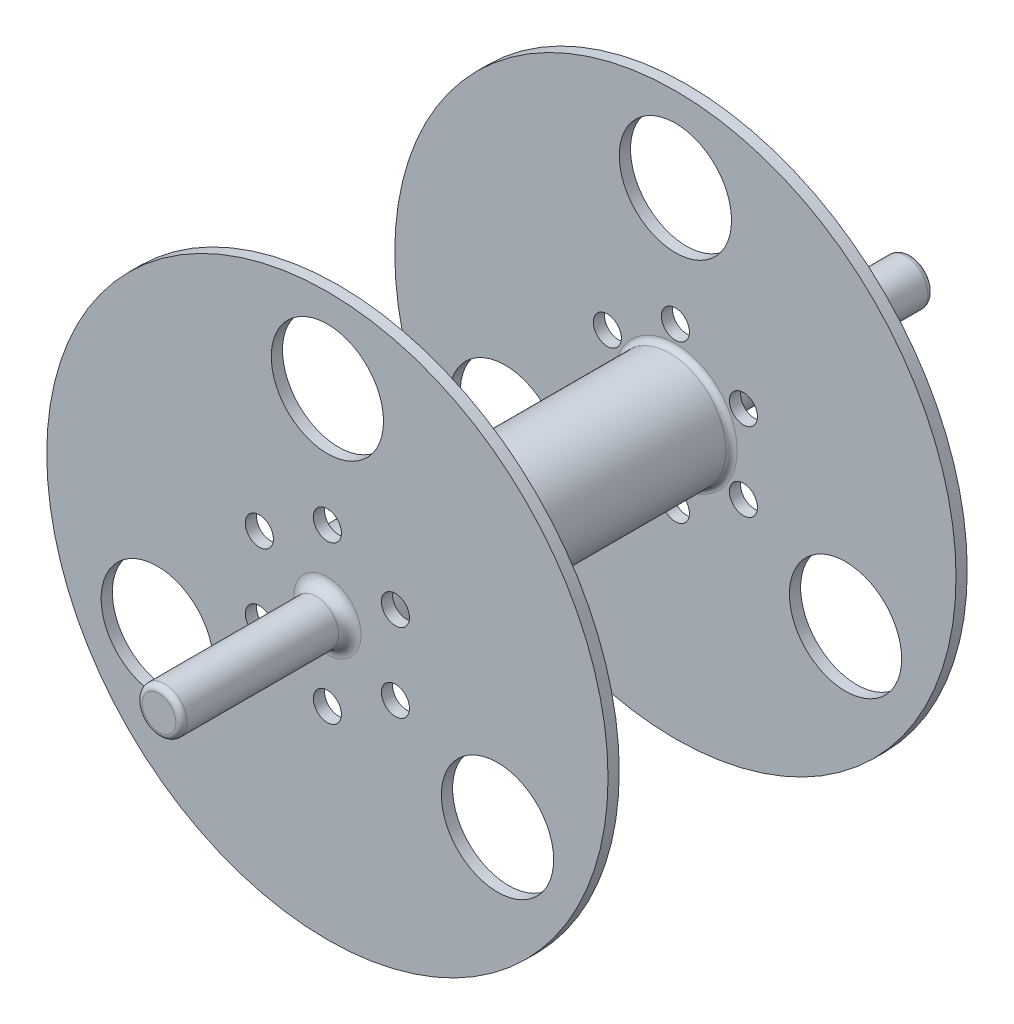
ISO-10303-21;
HEADER;
FILE_DESCRIPTION(('STEP AP214'),'2;1');
FILE_NAME('part.step','',(''),(''),'','','');
FILE_SCHEMA(('AUTOMOTIVE_DESIGN { 1 0 10303 214 1 1 1 1 }'));
ENDSEC;
DATA;
#1=APPLICATION_CONTEXT('core data for automotive mechanical design processes');
#2=APPLICATION_PROTOCOL_DEFINITION('international standard','automotive_design',2000,#1);
#3=PRODUCT_CONTEXT('',#1,'mechanical');
#4=PRODUCT('Part','Part','',(#3));
#5=PRODUCT_RELATED_PRODUCT_CATEGORY('part','',(#4));
#6=PRODUCT_DEFINITION_FORMATION('','',#4);
#7=PRODUCT_DEFINITION_CONTEXT('part definition',#1,'design');
#8=PRODUCT_DEFINITION('design','',#6,#7);
#9=PRODUCT_DEFINITION_SHAPE('','',#8);
#10=(LENGTH_UNIT() NAMED_UNIT(*) SI_UNIT(.MILLI.,.METRE.));
#11=(NAMED_UNIT(*) PLANE_ANGLE_UNIT() SI_UNIT($,.RADIAN.));
#12=(NAMED_UNIT(*) SI_UNIT($,.STERADIAN.) SOLID_ANGLE_UNIT());
#13=UNCERTAINTY_MEASURE_WITH_UNIT(LENGTH_MEASURE(1.E-05),#10,'distance_accuracy_value','');
#14=(GEOMETRIC_REPRESENTATION_CONTEXT(3) GLOBAL_UNCERTAINTY_ASSIGNED_CONTEXT((#13)) GLOBAL_UNIT_ASSIGNED_CONTEXT((#10,
#11,#12)) REPRESENTATION_CONTEXT('',''));
#15=CARTESIAN_POINT('',(0.,0.,0.));
#16=DIRECTION('',(0.,0.,1.));
#17=DIRECTION('',(1.,0.,0.));
#18=AXIS2_PLACEMENT_3D('',#15,#16,#17);
#19=CARTESIAN_POINT('',(0.,0.,64.));
#20=DIRECTION('',(0.,0.,1.));
#21=DIRECTION('',(1.,0.,0.));
#22=AXIS2_PLACEMENT_3D('',#19,#20,#21);
#23=PLANE('',#22);
#24=CARTESIAN_POINT('',(0.,0.,64.));
#25=DIRECTION('',(0.,0.,1.));
#26=DIRECTION('',(1.,0.,0.));
#27=AXIS2_PLACEMENT_3D('',#24,#25,#26);
#28=CIRCLE('',#27,6.);
#29=CARTESIAN_POINT('',(6.,0.,64.));
#30=VERTEX_POINT('',#29);
#31=EDGE_CURVE('E253',#30,#30,#28,.F.);
#32=ORIENTED_EDGE('',*,*,#31,.T.);
#33=EDGE_LOOP('',(#32));
#34=FACE_BOUND('',#33,.T.);
#35=CARTESIAN_POINT('',(30.3108891324553,-17.5,64.));
#36=DIRECTION('',(0.,0.,-1.));
#37=DIRECTION('',(-1.,0.,0.));
#38=AXIS2_PLACEMENT_3D('',#35,#36,#37);
#39=CIRCLE('',#38,10.);
#40=CARTESIAN_POINT('',(40.3108891324553,-17.5,64.));
#41=VERTEX_POINT('',#40);
#42=EDGE_CURVE('E232',#41,#41,#39,.T.);
#43=ORIENTED_EDGE('',*,*,#42,.T.);
#44=EDGE_LOOP('',(#43));
#45=FACE_BOUND('',#44,.T.);
#46=CARTESIAN_POINT('',(-30.3108891324554,-17.5,64.));
#47=DIRECTION('',(0.,0.,-1.));
#48=DIRECTION('',(-1.,0.,0.));
#49=AXIS2_PLACEMENT_3D('',#46,#47,#48);
#50=CIRCLE('',#49,10.);
#51=CARTESIAN_POINT('',(-20.3108891324554,-17.5,64.));
#52=VERTEX_POINT('',#51);
#53=EDGE_CURVE('E221',#52,#52,#50,.T.);
#54=ORIENTED_EDGE('',*,*,#53,.T.);
#55=EDGE_LOOP('',(#54));
#56=FACE_BOUND('',#55,.T.);
#57=CARTESIAN_POINT('',(-12.1243556529821,-7.,64.));
#58=DIRECTION('',(0.,0.,-1.));
#59=DIRECTION('',(-1.,0.,0.));
#60=AXIS2_PLACEMENT_3D('',#57,#58,#59);
#61=CIRCLE('',#60,2.5);
#62=CARTESIAN_POINT('',(-9.62435565298214,-7.,64.));
#63=VERTEX_POINT('',#62);
#64=EDGE_CURVE('E245',#63,#63,#61,.T.);
#65=ORIENTED_EDGE('',*,*,#64,.T.);
#66=EDGE_LOOP('',(#65));
#67=FACE_BOUND('',#66,.T.);
#68=CARTESIAN_POINT('',(12.1243556529821,7.,64.));
#69=DIRECTION('',(0.,0.,-1.));
#70=DIRECTION('',(-1.,0.,0.));
#71=AXIS2_PLACEMENT_3D('',#68,#69,#70);
#72=CIRCLE('',#71,2.5);
#73=CARTESIAN_POINT('',(14.6243556529821,7.,64.));
#74=VERTEX_POINT('',#73);
#75=EDGE_CURVE('E360',#74,#74,#72,.T.);
#76=ORIENTED_EDGE('',*,*,#75,.T.);
#77=EDGE_LOOP('',(#76));
#78=FACE_BOUND('',#77,.T.);
#79=CARTESIAN_POINT('',(0.,-14.,64.));
#80=DIRECTION('',(0.,0.,-1.));
#81=DIRECTION('',(-1.,0.,0.));
#82=AXIS2_PLACEMENT_3D('',#79,#80,#81);
#83=CIRCLE('',#82,2.5);
#84=CARTESIAN_POINT('',(2.5,-14.,64.));
#85=VERTEX_POINT('',#84);
#86=EDGE_CURVE('E294',#85,#85,#83,.T.);
#87=ORIENTED_EDGE('',*,*,#86,.T.);
#88=EDGE_LOOP('',(#87));
#89=FACE_BOUND('',#88,.T.);
#90=CARTESIAN_POINT('',(0.,14.,64.));
#91=DIRECTION('',(0.,0.,-1.));
#92=DIRECTION('',(-1.,0.,0.));
#93=AXIS2_PLACEMENT_3D('',#90,#91,#92);
#94=CIRCLE('',#93,2.5);
#95=CARTESIAN_POINT('',(2.5,14.,64.));
#96=VERTEX_POINT('',#95);
#97=EDGE_CURVE('E322',#96,#96,#94,.T.);
#98=ORIENTED_EDGE('',*,*,#97,.T.);
#99=EDGE_LOOP('',(#98));
#100=FACE_BOUND('',#99,.T.);
#101=CARTESIAN_POINT('',(0.,35.,64.));
#102=DIRECTION('',(0.,0.,-1.));
#103=DIRECTION('',(-1.,0.,0.));
#104=AXIS2_PLACEMENT_3D('',#101,#102,#103);
#105=CIRCLE('',#104,10.);
#106=CARTESIAN_POINT('',(10.,35.,64.));
#107=VERTEX_POINT('',#106);
#108=EDGE_CURVE('E227',#107,#107,#105,.T.);
#109=ORIENTED_EDGE('',*,*,#108,.T.);
#110=EDGE_LOOP('',(#109));
#111=FACE_BOUND('',#110,.T.);
#112=CARTESIAN_POINT('',(-12.1243556529821,7.,64.));
#113=DIRECTION('',(0.,0.,-1.));
#114=DIRECTION('',(-1.,0.,0.));
#115=AXIS2_PLACEMENT_3D('',#112,#113,#114);
#116=CIRCLE('',#115,2.5);
#117=CARTESIAN_POINT('',(-9.62435565298214,7.,64.));
#118=VERTEX_POINT('',#117);
#119=EDGE_CURVE('E313',#118,#118,#116,.T.);
#120=ORIENTED_EDGE('',*,*,#119,.T.);
#121=EDGE_LOOP('',(#120));
#122=FACE_BOUND('',#121,.T.);
#123=CARTESIAN_POINT('',(12.1243556529821,-7.,64.));
#124=DIRECTION('',(0.,0.,-1.));
#125=DIRECTION('',(-1.,0.,0.));
#126=AXIS2_PLACEMENT_3D('',#123,#124,#125);
#127=CIRCLE('',#126,2.5);
#128=CARTESIAN_POINT('',(14.6243556529821,-7.,64.));
#129=VERTEX_POINT('',#128);
#130=EDGE_CURVE('E276',#129,#129,#127,.T.);
#131=ORIENTED_EDGE('',*,*,#130,.T.);
#132=EDGE_LOOP('',(#131));
#133=FACE_BOUND('',#132,.T.);
#134=CARTESIAN_POINT('',(0.,0.,64.));
#135=DIRECTION('',(0.,0.,1.));
#136=DIRECTION('',(1.,0.,0.));
#137=AXIS2_PLACEMENT_3D('',#134,#135,#136);
#138=CIRCLE('',#137,50.);
#139=CARTESIAN_POINT('',(-50.,0.,64.));
#140=VERTEX_POINT('',#139);
#141=EDGE_CURVE('E199',#140,#140,#138,.T.);
#142=ORIENTED_EDGE('',*,*,#141,.T.);
#143=EDGE_LOOP('',(#142));
#144=FACE_BOUND('',#143,.T.);
#145=ADVANCED_FACE('F48',(#34,#45,#56,#67,#78,#89,#100,#111,#122,#133,#144),#23,.T.);
#146=CARTESIAN_POINT('',(0.,0.,63.));
#147=DIRECTION('',(0.,0.,1.));
#148=DIRECTION('',(1.,0.,0.));
#149=AXIS2_PLACEMENT_3D('',#146,#147,#148);
#150=CYLINDRICAL_SURFACE('',#149,50.);
#151=ORIENTED_EDGE('',*,*,#141,.F.);
#152=DIRECTION('',(0.,0.,-1.));
#153=VECTOR('',#152,1.);
#154=CARTESIAN_POINT('',(-50.,0.,63.));
#155=LINE('',#154,#153);
#156=CARTESIAN_POINT('',(-50.,0.,62.));
#157=VERTEX_POINT('',#156);
#158=EDGE_CURVE('E194',#140,#157,#155,.T.);
#159=ORIENTED_EDGE('',*,*,#158,.T.);
#160=CARTESIAN_POINT('',(0.,0.,62.));
#161=DIRECTION('',(0.,0.,1.));
#162=DIRECTION('',(1.,0.,0.));
#163=AXIS2_PLACEMENT_3D('',#160,#161,#162);
#164=CIRCLE('',#163,50.);
#165=EDGE_CURVE('E197',#157,#157,#164,.T.);
#166=ORIENTED_EDGE('',*,*,#165,.T.);
#167=ORIENTED_EDGE('',*,*,#158,.F.);
#168=EDGE_LOOP('',(#151,#159,#166,#167));
#169=FACE_BOUND('',#168,.T.);
#170=ADVANCED_FACE('F195',(#169),#150,.T.);
#171=CARTESIAN_POINT('',(50.,0.,62.));
#172=DIRECTION('',(0.,0.,-1.));
#173=DIRECTION('',(0.,-1.,0.));
#174=AXIS2_PLACEMENT_3D('',#171,#172,#173);
#175=PLANE('',#174);
#176=CARTESIAN_POINT('',(0.,0.,62.));
#177=DIRECTION('',(0.,0.,-1.));
#178=DIRECTION('',(-1.,0.,0.));
#179=AXIS2_PLACEMENT_3D('',#176,#177,#178);
#180=CIRCLE('',#179,11.);
#181=CARTESIAN_POINT('',(-11.,0.,62.));
#182=VERTEX_POINT('',#181);
#183=EDGE_CURVE('E268',#182,#182,#180,.F.);
#184=ORIENTED_EDGE('',*,*,#183,.T.);
#185=EDGE_LOOP('',(#184));
#186=FACE_BOUND('',#185,.T.);
#187=CARTESIAN_POINT('',(30.3108891324553,-17.5,62.));
#188=DIRECTION('',(0.,0.,1.));
#189=DIRECTION('',(-1.,0.,0.));
#190=AXIS2_PLACEMENT_3D('',#187,#188,#189);
#191=CIRCLE('',#190,10.);
#192=CARTESIAN_POINT('',(40.3108891324553,-17.5,62.));
#193=VERTEX_POINT('',#192);
#194=EDGE_CURVE('E343',#193,#193,#191,.T.);
#195=ORIENTED_EDGE('',*,*,#194,.T.);
#196=EDGE_LOOP('',(#195));
#197=FACE_BOUND('',#196,.T.);
#198=CARTESIAN_POINT('',(-30.3108891324554,-17.5,62.));
#199=DIRECTION('',(0.,0.,1.));
#200=DIRECTION('',(-1.,0.,0.));
#201=AXIS2_PLACEMENT_3D('',#198,#199,#200);
#202=CIRCLE('',#201,10.);
#203=CARTESIAN_POINT('',(-20.3108891324554,-17.5,62.));
#204=VERTEX_POINT('',#203);
#205=EDGE_CURVE('E337',#204,#204,#202,.T.);
#206=ORIENTED_EDGE('',*,*,#205,.T.);
#207=EDGE_LOOP('',(#206));
#208=FACE_BOUND('',#207,.T.);
#209=CARTESIAN_POINT('',(-12.1243556529821,-7.,62.));
#210=DIRECTION('',(0.,0.,1.));
#211=DIRECTION('',(-1.,0.,0.));
#212=AXIS2_PLACEMENT_3D('',#209,#210,#211);
#213=CIRCLE('',#212,2.5);
#214=CARTESIAN_POINT('',(-9.62435565298214,-7.,62.));
#215=VERTEX_POINT('',#214);
#216=EDGE_CURVE('E290',#215,#215,#213,.T.);
#217=ORIENTED_EDGE('',*,*,#216,.T.);
#218=EDGE_LOOP('',(#217));
#219=FACE_BOUND('',#218,.T.);
#220=CARTESIAN_POINT('',(12.1243556529821,7.,62.));
#221=DIRECTION('',(0.,0.,1.));
#222=DIRECTION('',(-1.,0.,0.));
#223=AXIS2_PLACEMENT_3D('',#220,#221,#222);
#224=CIRCLE('',#223,2.5);
#225=CARTESIAN_POINT('',(14.6243556529821,7.,62.));
#226=VERTEX_POINT('',#225);
#227=EDGE_CURVE('E355',#226,#226,#224,.T.);
#228=ORIENTED_EDGE('',*,*,#227,.T.);
#229=EDGE_LOOP('',(#228));
#230=FACE_BOUND('',#229,.T.);
#231=CARTESIAN_POINT('',(0.,-14.,62.));
#232=DIRECTION('',(0.,0.,1.));
#233=DIRECTION('',(-1.,0.,0.));
#234=AXIS2_PLACEMENT_3D('',#231,#232,#233);
#235=CIRCLE('',#234,2.5);
#236=CARTESIAN_POINT('',(2.5,-14.,62.));
#237=VERTEX_POINT('',#236);
#238=EDGE_CURVE('E314',#237,#237,#235,.T.);
#239=ORIENTED_EDGE('',*,*,#238,.T.);
#240=EDGE_LOOP('',(#239));
#241=FACE_BOUND('',#240,.T.);
#242=CARTESIAN_POINT('',(0.,14.,62.));
#243=DIRECTION('',(0.,0.,1.));
#244=DIRECTION('',(-1.,0.,0.));
#245=AXIS2_PLACEMENT_3D('',#242,#243,#244);
#246=CIRCLE('',#245,2.5);
#247=CARTESIAN_POINT('',(2.5,14.,62.));
#248=VERTEX_POINT('',#247);
#249=EDGE_CURVE('E210',#248,#248,#246,.T.);
#250=ORIENTED_EDGE('',*,*,#249,.T.);
#251=EDGE_LOOP('',(#250));
#252=FACE_BOUND('',#251,.T.);
#253=CARTESIAN_POINT('',(0.,35.,62.));
#254=DIRECTION('',(0.,0.,1.));
#255=DIRECTION('',(-1.,0.,0.));
#256=AXIS2_PLACEMENT_3D('',#253,#254,#255);
#257=CIRCLE('',#256,10.);
#258=CARTESIAN_POINT('',(10.,35.,62.));
#259=VERTEX_POINT('',#258);
#260=EDGE_CURVE('E226',#259,#259,#257,.T.);
#261=ORIENTED_EDGE('',*,*,#260,.T.);
#262=EDGE_LOOP('',(#261));
#263=FACE_BOUND('',#262,.T.);
#264=CARTESIAN_POINT('',(-12.1243556529821,7.,62.));
#265=DIRECTION('',(0.,0.,1.));
#266=DIRECTION('',(-1.,0.,0.));
#267=AXIS2_PLACEMENT_3D('',#264,#265,#266);
#268=CIRCLE('',#267,2.5);
#269=CARTESIAN_POINT('',(-9.62435565298214,7.,62.));
#270=VERTEX_POINT('',#269);
#271=EDGE_CURVE('E308',#270,#270,#268,.T.);
#272=ORIENTED_EDGE('',*,*,#271,.T.);
#273=EDGE_LOOP('',(#272));
#274=FACE_BOUND('',#273,.T.);
#275=CARTESIAN_POINT('',(12.1243556529821,-7.,62.));
#276=DIRECTION('',(0.,0.,1.));
#277=DIRECTION('',(-1.,0.,0.));
#278=AXIS2_PLACEMENT_3D('',#275,#276,#277);
#279=CIRCLE('',#278,2.5);
#280=CARTESIAN_POINT('',(14.6243556529821,-7.,62.));
#281=VERTEX_POINT('',#280);
#282=EDGE_CURVE('E286',#281,#281,#279,.T.);
#283=ORIENTED_EDGE('',*,*,#282,.T.);
#284=EDGE_LOOP('',(#283));
#285=FACE_BOUND('',#284,.T.);
#286=ORIENTED_EDGE('',*,*,#165,.F.);
#287=EDGE_LOOP('',(#286));
#288=FACE_BOUND('',#287,.T.);
#289=ADVANCED_FACE('F426',(#186,#197,#208,#219,#230,#241,#252,#263,#274,#285,#288),#175,.T.);
#290=CARTESIAN_POINT('',(0.,0.,32.));
#291=DIRECTION('',(0.,0.,1.));
#292=DIRECTION('',(1.,0.,0.));
#293=AXIS2_PLACEMENT_3D('',#290,#291,#292);
#294=CYLINDRICAL_SURFACE('',#293,10.);
#295=DIRECTION('',(0.,0.,-1.));
#296=VECTOR('',#295,1.);
#297=CARTESIAN_POINT('',(-10.,0.,32.));
#298=LINE('',#297,#296);
#299=CARTESIAN_POINT('',(-10.,0.,61.));
#300=VERTEX_POINT('',#299);
#301=CARTESIAN_POINT('',(-10.,0.,3.));
#302=VERTEX_POINT('',#301);
#303=EDGE_CURVE('E243',#300,#302,#298,.T.);
#304=ORIENTED_EDGE('',*,*,#303,.F.);
#305=CARTESIAN_POINT('',(0.,0.,61.));
#306=DIRECTION('',(0.,0.,-1.));
#307=DIRECTION('',(-1.,0.,0.));
#308=AXIS2_PLACEMENT_3D('',#305,#306,#307);
#309=CIRCLE('',#308,10.);
#310=EDGE_CURVE('E57',#300,#300,#309,.T.);
#311=ORIENTED_EDGE('',*,*,#310,.T.);
#312=ORIENTED_EDGE('',*,*,#303,.T.);
#313=CARTESIAN_POINT('',(0.,0.,3.));
#314=DIRECTION('',(0.,0.,1.));
#315=DIRECTION('',(1.,0.,0.));
#316=AXIS2_PLACEMENT_3D('',#313,#314,#315);
#317=CIRCLE('',#316,10.);
#318=EDGE_CURVE('E271',#302,#302,#317,.T.);
#319=ORIENTED_EDGE('',*,*,#318,.T.);
#320=EDGE_LOOP('',(#304,#311,#312,#319));
#321=FACE_BOUND('',#320,.T.);
#322=ADVANCED_FACE('F429',(#321),#294,.T.);
#323=CARTESIAN_POINT('',(10.,0.,2.));
#324=DIRECTION('',(0.,0.,1.));
#325=DIRECTION('',(1.,0.,0.));
#326=AXIS2_PLACEMENT_3D('',#323,#324,#325);
#327=PLANE('',#326);
#328=CARTESIAN_POINT('',(0.,0.,2.));
#329=DIRECTION('',(0.,0.,1.));
#330=DIRECTION('',(1.,0.,0.));
#331=AXIS2_PLACEMENT_3D('',#328,#329,#330);
#332=CIRCLE('',#331,11.);
#333=CARTESIAN_POINT('',(-11.,0.,2.));
#334=VERTEX_POINT('',#333);
#335=EDGE_CURVE('E11',#334,#334,#332,.F.);
#336=ORIENTED_EDGE('',*,*,#335,.T.);
#337=EDGE_LOOP('',(#336));
#338=FACE_BOUND('',#337,.T.);
#339=CARTESIAN_POINT('',(30.3108891324553,-17.5,2.));
#340=DIRECTION('',(0.,0.,-1.));
#341=DIRECTION('',(-1.,0.,0.));
#342=AXIS2_PLACEMENT_3D('',#339,#340,#341);
#343=CIRCLE('',#342,10.);
#344=CARTESIAN_POINT('',(40.3108891324553,-17.5,2.));
#345=VERTEX_POINT('',#344);
#346=EDGE_CURVE('E299',#345,#345,#343,.T.);
#347=ORIENTED_EDGE('',*,*,#346,.T.);
#348=EDGE_LOOP('',(#347));
#349=FACE_BOUND('',#348,.T.);
#350=CARTESIAN_POINT('',(-30.3108891324554,-17.5,2.));
#351=DIRECTION('',(0.,0.,-1.));
#352=DIRECTION('',(-1.,0.,0.));
#353=AXIS2_PLACEMENT_3D('',#350,#351,#352);
#354=CIRCLE('',#353,10.);
#355=CARTESIAN_POINT('',(-20.3108891324554,-17.5,2.));
#356=VERTEX_POINT('',#355);
#357=EDGE_CURVE('E240',#356,#356,#354,.T.);
#358=ORIENTED_EDGE('',*,*,#357,.T.);
#359=EDGE_LOOP('',(#358));
#360=FACE_BOUND('',#359,.T.);
#361=CARTESIAN_POINT('',(-12.1243556529821,-7.,2.));
#362=DIRECTION('',(0.,0.,-1.));
#363=DIRECTION('',(-1.,0.,0.));
#364=AXIS2_PLACEMENT_3D('',#361,#362,#363);
#365=CIRCLE('',#364,2.5);
#366=CARTESIAN_POINT('',(-9.62435565298214,-7.,2.));
#367=VERTEX_POINT('',#366);
#368=EDGE_CURVE('E349',#367,#367,#365,.T.);
#369=ORIENTED_EDGE('',*,*,#368,.T.);
#370=EDGE_LOOP('',(#369));
#371=FACE_BOUND('',#370,.T.);
#372=CARTESIAN_POINT('',(12.1243556529821,7.,2.));
#373=DIRECTION('',(0.,0.,-1.));
#374=DIRECTION('',(-1.,0.,0.));
#375=AXIS2_PLACEMENT_3D('',#372,#373,#374);
#376=CIRCLE('',#375,2.5);
#377=CARTESIAN_POINT('',(14.6243556529821,7.,2.));
#378=VERTEX_POINT('',#377);
#379=EDGE_CURVE('E352',#378,#378,#376,.T.);
#380=ORIENTED_EDGE('',*,*,#379,.T.);
#381=EDGE_LOOP('',(#380));
#382=FACE_BOUND('',#381,.T.);
#383=CARTESIAN_POINT('',(0.,-14.,2.));
#384=DIRECTION('',(0.,0.,-1.));
#385=DIRECTION('',(-1.,0.,0.));
#386=AXIS2_PLACEMENT_3D('',#383,#384,#385);
#387=CIRCLE('',#386,2.5);
#388=CARTESIAN_POINT('',(2.5,-14.,2.));
#389=VERTEX_POINT('',#388);
#390=EDGE_CURVE('E316',#389,#389,#387,.T.);
#391=ORIENTED_EDGE('',*,*,#390,.T.);
#392=EDGE_LOOP('',(#391));
#393=FACE_BOUND('',#392,.T.);
#394=CARTESIAN_POINT('',(0.,14.,2.));
#395=DIRECTION('',(0.,0.,-1.));
#396=DIRECTION('',(-1.,0.,0.));
#397=AXIS2_PLACEMENT_3D('',#394,#395,#396);
#398=CIRCLE('',#397,2.5);
#399=CARTESIAN_POINT('',(2.5,14.,2.));
#400=VERTEX_POINT('',#399);
#401=EDGE_CURVE('E212',#400,#400,#398,.T.);
#402=ORIENTED_EDGE('',*,*,#401,.T.);
#403=EDGE_LOOP('',(#402));
#404=FACE_BOUND('',#403,.T.);
#405=CARTESIAN_POINT('',(0.,35.,2.));
#406=DIRECTION('',(0.,0.,-1.));
#407=DIRECTION('',(-1.,0.,0.));
#408=AXIS2_PLACEMENT_3D('',#405,#406,#407);
#409=CIRCLE('',#408,10.);
#410=CARTESIAN_POINT('',(10.,35.,2.));
#411=VERTEX_POINT('',#410);
#412=EDGE_CURVE('E340',#411,#411,#409,.T.);
#413=ORIENTED_EDGE('',*,*,#412,.T.);
#414=EDGE_LOOP('',(#413));
#415=FACE_BOUND('',#414,.T.);
#416=CARTESIAN_POINT('',(-12.1243556529821,7.,2.));
#417=DIRECTION('',(0.,0.,-1.));
#418=DIRECTION('',(-1.,0.,0.));
#419=AXIS2_PLACEMENT_3D('',#416,#417,#418);
#420=CIRCLE('',#419,2.5);
#421=CARTESIAN_POINT('',(-9.62435565298214,7.,2.));
#422=VERTEX_POINT('',#421);
#423=EDGE_CURVE('E208',#422,#422,#420,.T.);
#424=ORIENTED_EDGE('',*,*,#423,.T.);
#425=EDGE_LOOP('',(#424));
#426=FACE_BOUND('',#425,.T.);
#427=CARTESIAN_POINT('',(12.1243556529821,-7.,2.));
#428=DIRECTION('',(0.,0.,-1.));
#429=DIRECTION('',(-1.,0.,0.));
#430=AXIS2_PLACEMENT_3D('',#427,#428,#429);
#431=CIRCLE('',#430,2.5);
#432=CARTESIAN_POINT('',(14.6243556529821,-7.,2.));
#433=VERTEX_POINT('',#432);
#434=EDGE_CURVE('E304',#433,#433,#431,.T.);
#435=ORIENTED_EDGE('',*,*,#434,.T.);
#436=EDGE_LOOP('',(#435));
#437=FACE_BOUND('',#436,.T.);
#438=CARTESIAN_POINT('',(0.,0.,2.));
#439=DIRECTION('',(0.,0.,1.));
#440=DIRECTION('',(1.,0.,0.));
#441=AXIS2_PLACEMENT_3D('',#438,#439,#440);
#442=CIRCLE('',#441,50.);
#443=CARTESIAN_POINT('',(-50.,0.,2.));
#444=VERTEX_POINT('',#443);
#445=EDGE_CURVE('E217',#444,#444,#442,.T.);
#446=ORIENTED_EDGE('',*,*,#445,.T.);
#447=EDGE_LOOP('',(#446));
#448=FACE_BOUND('',#447,.T.);
#449=ADVANCED_FACE('F536',(#338,#349,#360,#371,#382,#393,#404,#415,#426,#437,#448),#327,.T.);
#450=CARTESIAN_POINT('',(0.,0.,1.));
#451=DIRECTION('',(0.,0.,1.));
#452=DIRECTION('',(1.,0.,0.));
#453=AXIS2_PLACEMENT_3D('',#450,#451,#452);
#454=CYLINDRICAL_SURFACE('',#453,50.);
#455=ORIENTED_EDGE('',*,*,#445,.F.);
#456=DIRECTION('',(0.,0.,-1.));
#457=VECTOR('',#456,1.);
#458=CARTESIAN_POINT('',(-50.,0.,1.));
#459=LINE('',#458,#457);
#460=CARTESIAN_POINT('',(-50.,0.,0.));
#461=VERTEX_POINT('',#460);
#462=EDGE_CURVE('E241',#444,#461,#459,.T.);
#463=ORIENTED_EDGE('',*,*,#462,.T.);
#464=CARTESIAN_POINT('',(0.,0.,0.));
#465=DIRECTION('',(0.,0.,1.));
#466=DIRECTION('',(1.,0.,0.));
#467=AXIS2_PLACEMENT_3D('',#464,#465,#466);
#468=CIRCLE('',#467,50.);
#469=EDGE_CURVE('E214',#461,#461,#468,.T.);
#470=ORIENTED_EDGE('',*,*,#469,.T.);
#471=ORIENTED_EDGE('',*,*,#462,.F.);
#472=EDGE_LOOP('',(#455,#463,#470,#471));
#473=FACE_BOUND('',#472,.T.);
#474=ADVANCED_FACE('F521',(#473),#454,.T.);
#475=CARTESIAN_POINT('',(30.3108891324553,-17.5,64.));
#476=DIRECTION('',(0.,0.,-1.));
#477=DIRECTION('',(-1.,0.,0.));
#478=AXIS2_PLACEMENT_3D('',#475,#476,#477);
#479=CYLINDRICAL_SURFACE('',#478,10.);
#480=ORIENTED_EDGE('',*,*,#346,.F.);
#481=DIRECTION('',(0.,0.,-1.));
#482=VECTOR('',#481,1.);
#483=CARTESIAN_POINT('',(40.3108891324553,-17.5,64.));
#484=LINE('',#483,#482);
#485=CARTESIAN_POINT('',(40.3108891324553,-17.5,0.));
#486=VERTEX_POINT('',#485);
#487=EDGE_CURVE('E296',#345,#486,#484,.T.);
#488=ORIENTED_EDGE('',*,*,#487,.T.);
#489=CARTESIAN_POINT('',(30.3108891324553,-17.5,0.));
#490=DIRECTION('',(0.,0.,1.));
#491=DIRECTION('',(-1.,0.,0.));
#492=AXIS2_PLACEMENT_3D('',#489,#490,#491);
#493=CIRCLE('',#492,10.);
#494=EDGE_CURVE('E218',#486,#486,#493,.T.);
#495=ORIENTED_EDGE('',*,*,#494,.F.);
#496=ORIENTED_EDGE('',*,*,#487,.F.);
#497=EDGE_LOOP('',(#480,#488,#495,#496));
#498=FACE_BOUND('',#497,.T.);
#499=ADVANCED_FACE('F518',(#498),#479,.F.);
#500=CARTESIAN_POINT('',(30.3108891324553,-17.5,64.));
#501=DIRECTION('',(0.,0.,-1.));
#502=DIRECTION('',(-1.,0.,0.));
#503=AXIS2_PLACEMENT_3D('',#500,#501,#502);
#504=CYLINDRICAL_SURFACE('',#503,10.);
#505=ORIENTED_EDGE('',*,*,#42,.F.);
#506=DIRECTION('',(0.,0.,-1.));
#507=VECTOR('',#506,1.);
#508=CARTESIAN_POINT('',(40.3108891324553,-17.5,64.));
#509=LINE('',#508,#507);
#510=EDGE_CURVE('E235',#41,#193,#509,.T.);
#511=ORIENTED_EDGE('',*,*,#510,.T.);
#512=ORIENTED_EDGE('',*,*,#194,.F.);
#513=ORIENTED_EDGE('',*,*,#510,.F.);
#514=EDGE_LOOP('',(#505,#511,#512,#513));
#515=FACE_BOUND('',#514,.T.);
#516=ADVANCED_FACE('F406',(#515),#504,.F.);
#517=CARTESIAN_POINT('',(-30.3108891324554,-17.5,64.));
#518=DIRECTION('',(0.,0.,-1.));
#519=DIRECTION('',(-1.,0.,0.));
#520=AXIS2_PLACEMENT_3D('',#517,#518,#519);
#521=CYLINDRICAL_SURFACE('',#520,10.);
#522=ORIENTED_EDGE('',*,*,#357,.F.);
#523=DIRECTION('',(0.,0.,-1.));
#524=VECTOR('',#523,1.);
#525=CARTESIAN_POINT('',(-20.3108891324554,-17.5,64.));
#526=LINE('',#525,#524);
#527=CARTESIAN_POINT('',(-20.3108891324554,-17.5,0.));
#528=VERTEX_POINT('',#527);
#529=EDGE_CURVE('E237',#356,#528,#526,.T.);
#530=ORIENTED_EDGE('',*,*,#529,.T.);
#531=CARTESIAN_POINT('',(-30.3108891324554,-17.5,0.));
#532=DIRECTION('',(0.,0.,1.));
#533=DIRECTION('',(-1.,0.,0.));
#534=AXIS2_PLACEMENT_3D('',#531,#532,#533);
#535=CIRCLE('',#534,10.);
#536=EDGE_CURVE('E236',#528,#528,#535,.T.);
#537=ORIENTED_EDGE('',*,*,#536,.F.);
#538=ORIENTED_EDGE('',*,*,#529,.F.);
#539=EDGE_LOOP('',(#522,#530,#537,#538));
#540=FACE_BOUND('',#539,.T.);
#541=ADVANCED_FACE('F516',(#540),#521,.F.);
#542=CARTESIAN_POINT('',(-30.3108891324554,-17.5,64.));
#543=DIRECTION('',(0.,0.,-1.));
#544=DIRECTION('',(-1.,0.,0.));
#545=AXIS2_PLACEMENT_3D('',#542,#543,#544);
#546=CYLINDRICAL_SURFACE('',#545,10.);
#547=ORIENTED_EDGE('',*,*,#53,.F.);
#548=DIRECTION('',(0.,0.,-1.));
#549=VECTOR('',#548,1.);
#550=CARTESIAN_POINT('',(-20.3108891324554,-17.5,64.));
#551=LINE('',#550,#549);
#552=EDGE_CURVE('E336',#52,#204,#551,.T.);
#553=ORIENTED_EDGE('',*,*,#552,.T.);
#554=ORIENTED_EDGE('',*,*,#205,.F.);
#555=ORIENTED_EDGE('',*,*,#552,.F.);
#556=EDGE_LOOP('',(#547,#553,#554,#555));
#557=FACE_BOUND('',#556,.T.);
#558=ADVANCED_FACE('F512',(#557),#546,.F.);
#559=CARTESIAN_POINT('',(-12.1243556529821,-7.,64.));
#560=DIRECTION('',(0.,0.,-1.));
#561=DIRECTION('',(-1.,0.,0.));
#562=AXIS2_PLACEMENT_3D('',#559,#560,#561);
#563=CYLINDRICAL_SURFACE('',#562,2.5);
#564=ORIENTED_EDGE('',*,*,#368,.F.);
#565=DIRECTION('',(0.,0.,-1.));
#566=VECTOR('',#565,1.);
#567=CARTESIAN_POINT('',(-9.62435565298214,-7.,64.));
#568=LINE('',#567,#566);
#569=CARTESIAN_POINT('',(-9.62435565298214,-7.,0.));
#570=VERTEX_POINT('',#569);
#571=EDGE_CURVE('E222',#367,#570,#568,.T.);
#572=ORIENTED_EDGE('',*,*,#571,.T.);
#573=CARTESIAN_POINT('',(-12.1243556529821,-7.,0.));
#574=DIRECTION('',(0.,0.,1.));
#575=DIRECTION('',(-1.,0.,0.));
#576=AXIS2_PLACEMENT_3D('',#573,#574,#575);
#577=CIRCLE('',#576,2.5);
#578=EDGE_CURVE('E219',#570,#570,#577,.T.);
#579=ORIENTED_EDGE('',*,*,#578,.F.);
#580=ORIENTED_EDGE('',*,*,#571,.F.);
#581=EDGE_LOOP('',(#564,#572,#579,#580));
#582=FACE_BOUND('',#581,.T.);
#583=ADVANCED_FACE('F515',(#582),#563,.F.);
#584=CARTESIAN_POINT('',(-12.1243556529821,-7.,64.));
#585=DIRECTION('',(0.,0.,-1.));
#586=DIRECTION('',(-1.,0.,0.));
#587=AXIS2_PLACEMENT_3D('',#584,#585,#586);
#588=CYLINDRICAL_SURFACE('',#587,2.5);
#589=ORIENTED_EDGE('',*,*,#64,.F.);
#590=DIRECTION('',(0.,0.,-1.));
#591=VECTOR('',#590,1.);
#592=CARTESIAN_POINT('',(-9.62435565298214,-7.,64.));
#593=LINE('',#592,#591);
#594=EDGE_CURVE('E303',#63,#215,#593,.T.);
#595=ORIENTED_EDGE('',*,*,#594,.T.);
#596=ORIENTED_EDGE('',*,*,#216,.F.);
#597=ORIENTED_EDGE('',*,*,#594,.F.);
#598=EDGE_LOOP('',(#589,#595,#596,#597));
#599=FACE_BOUND('',#598,.T.);
#600=ADVANCED_FACE('F530',(#599),#588,.F.);
#601=CARTESIAN_POINT('',(12.1243556529821,7.,64.));
#602=DIRECTION('',(0.,0.,-1.));
#603=DIRECTION('',(-1.,0.,0.));
#604=AXIS2_PLACEMENT_3D('',#601,#602,#603);
#605=CYLINDRICAL_SURFACE('',#604,2.5);
#606=ORIENTED_EDGE('',*,*,#379,.F.);
#607=DIRECTION('',(0.,0.,-1.));
#608=VECTOR('',#607,1.);
#609=CARTESIAN_POINT('',(14.6243556529821,7.,64.));
#610=LINE('',#609,#608);
#611=CARTESIAN_POINT('',(14.6243556529821,7.,0.));
#612=VERTEX_POINT('',#611);
#613=EDGE_CURVE('E246',#378,#612,#610,.T.);
#614=ORIENTED_EDGE('',*,*,#613,.T.);
#615=CARTESIAN_POINT('',(12.1243556529821,7.,0.));
#616=DIRECTION('',(0.,0.,1.));
#617=DIRECTION('',(-1.,0.,0.));
#618=AXIS2_PLACEMENT_3D('',#615,#616,#617);
#619=CIRCLE('',#618,2.5);
#620=EDGE_CURVE('E244',#612,#612,#619,.T.);
#621=ORIENTED_EDGE('',*,*,#620,.F.);
#622=ORIENTED_EDGE('',*,*,#613,.F.);
#623=EDGE_LOOP('',(#606,#614,#621,#622));
#624=FACE_BOUND('',#623,.T.);
#625=ADVANCED_FACE('F506',(#624),#605,.F.);
#626=CARTESIAN_POINT('',(12.1243556529821,7.,64.));
#627=DIRECTION('',(0.,0.,-1.));
#628=DIRECTION('',(-1.,0.,0.));
#629=AXIS2_PLACEMENT_3D('',#626,#627,#628);
#630=CYLINDRICAL_SURFACE('',#629,2.5);
#631=ORIENTED_EDGE('',*,*,#75,.F.);
#632=DIRECTION('',(0.,0.,-1.));
#633=VECTOR('',#632,1.);
#634=CARTESIAN_POINT('',(14.6243556529821,7.,64.));
#635=LINE('',#634,#633);
#636=EDGE_CURVE('E357',#74,#226,#635,.T.);
#637=ORIENTED_EDGE('',*,*,#636,.T.);
#638=ORIENTED_EDGE('',*,*,#227,.F.);
#639=ORIENTED_EDGE('',*,*,#636,.F.);
#640=EDGE_LOOP('',(#631,#637,#638,#639));
#641=FACE_BOUND('',#640,.T.);
#642=ADVANCED_FACE('F503',(#641),#630,.F.);
#643=CARTESIAN_POINT('',(0.,-14.,64.));
#644=DIRECTION('',(0.,0.,-1.));
#645=DIRECTION('',(-1.,0.,0.));
#646=AXIS2_PLACEMENT_3D('',#643,#644,#645);
#647=CYLINDRICAL_SURFACE('',#646,2.5);
#648=ORIENTED_EDGE('',*,*,#390,.F.);
#649=DIRECTION('',(0.,0.,-1.));
#650=VECTOR('',#649,1.);
#651=CARTESIAN_POINT('',(2.5,-14.,64.));
#652=LINE('',#651,#650);
#653=CARTESIAN_POINT('',(2.5,-14.,0.));
#654=VERTEX_POINT('',#653);
#655=EDGE_CURVE('E325',#389,#654,#652,.T.);
#656=ORIENTED_EDGE('',*,*,#655,.T.);
#657=CARTESIAN_POINT('',(0.,-14.,0.));
#658=DIRECTION('',(0.,0.,1.));
#659=DIRECTION('',(-1.,0.,0.));
#660=AXIS2_PLACEMENT_3D('',#657,#658,#659);
#661=CIRCLE('',#660,2.5);
#662=EDGE_CURVE('E328',#654,#654,#661,.T.);
#663=ORIENTED_EDGE('',*,*,#662,.F.);
#664=ORIENTED_EDGE('',*,*,#655,.F.);
#665=EDGE_LOOP('',(#648,#656,#663,#664));
#666=FACE_BOUND('',#665,.T.);
#667=ADVANCED_FACE('F450',(#666),#647,.F.);
#668=CARTESIAN_POINT('',(0.,-14.,64.));
#669=DIRECTION('',(0.,0.,-1.));
#670=DIRECTION('',(-1.,0.,0.));
#671=AXIS2_PLACEMENT_3D('',#668,#669,#670);
#672=CYLINDRICAL_SURFACE('',#671,2.5);
#673=ORIENTED_EDGE('',*,*,#86,.F.);
#674=DIRECTION('',(0.,0.,-1.));
#675=VECTOR('',#674,1.);
#676=CARTESIAN_POINT('',(2.5,-14.,64.));
#677=LINE('',#676,#675);
#678=EDGE_CURVE('E317',#85,#237,#677,.T.);
#679=ORIENTED_EDGE('',*,*,#678,.T.);
#680=ORIENTED_EDGE('',*,*,#238,.F.);
#681=ORIENTED_EDGE('',*,*,#678,.F.);
#682=EDGE_LOOP('',(#673,#679,#680,#681));
#683=FACE_BOUND('',#682,.T.);
#684=ADVANCED_FACE('F524',(#683),#672,.F.);
#685=CARTESIAN_POINT('',(0.,14.,64.));
#686=DIRECTION('',(0.,0.,-1.));
#687=DIRECTION('',(-1.,0.,0.));
#688=AXIS2_PLACEMENT_3D('',#685,#686,#687);
#689=CYLINDRICAL_SURFACE('',#688,2.5);
#690=ORIENTED_EDGE('',*,*,#401,.F.);
#691=DIRECTION('',(0.,0.,-1.));
#692=VECTOR('',#691,1.);
#693=CARTESIAN_POINT('',(2.5,14.,64.));
#694=LINE('',#693,#692);
#695=CARTESIAN_POINT('',(2.5,14.,0.));
#696=VERTEX_POINT('',#695);
#697=EDGE_CURVE('E295',#400,#696,#694,.T.);
#698=ORIENTED_EDGE('',*,*,#697,.T.);
#699=CARTESIAN_POINT('',(0.,14.,0.));
#700=DIRECTION('',(0.,0.,1.));
#701=DIRECTION('',(-1.,0.,0.));
#702=AXIS2_PLACEMENT_3D('',#699,#700,#701);
#703=CIRCLE('',#702,2.5);
#704=EDGE_CURVE('E292',#696,#696,#703,.T.);
#705=ORIENTED_EDGE('',*,*,#704,.F.);
#706=ORIENTED_EDGE('',*,*,#697,.F.);
#707=EDGE_LOOP('',(#690,#698,#705,#706));
#708=FACE_BOUND('',#707,.T.);
#709=ADVANCED_FACE('F510',(#708),#689,.F.);
#710=CARTESIAN_POINT('',(0.,14.,64.));
#711=DIRECTION('',(0.,0.,-1.));
#712=DIRECTION('',(-1.,0.,0.));
#713=AXIS2_PLACEMENT_3D('',#710,#711,#712);
#714=CYLINDRICAL_SURFACE('',#713,2.5);
#715=ORIENTED_EDGE('',*,*,#97,.F.);
#716=DIRECTION('',(0.,0.,-1.));
#717=VECTOR('',#716,1.);
#718=CARTESIAN_POINT('',(2.5,14.,64.));
#719=LINE('',#718,#717);
#720=EDGE_CURVE('E213',#96,#248,#719,.T.);
#721=ORIENTED_EDGE('',*,*,#720,.T.);
#722=ORIENTED_EDGE('',*,*,#249,.F.);
#723=ORIENTED_EDGE('',*,*,#720,.F.);
#724=EDGE_LOOP('',(#715,#721,#722,#723));
#725=FACE_BOUND('',#724,.T.);
#726=ADVANCED_FACE('F498',(#725),#714,.F.);
#727=CARTESIAN_POINT('',(0.,35.,64.));
#728=DIRECTION('',(0.,0.,-1.));
#729=DIRECTION('',(-1.,0.,0.));
#730=AXIS2_PLACEMENT_3D('',#727,#728,#729);
#731=CYLINDRICAL_SURFACE('',#730,10.);
#732=ORIENTED_EDGE('',*,*,#412,.F.);
#733=DIRECTION('',(0.,0.,-1.));
#734=VECTOR('',#733,1.);
#735=CARTESIAN_POINT('',(10.,35.,64.));
#736=LINE('',#735,#734);
#737=CARTESIAN_POINT('',(10.,35.,0.));
#738=VERTEX_POINT('',#737);
#739=EDGE_CURVE('E367',#411,#738,#736,.T.);
#740=ORIENTED_EDGE('',*,*,#739,.T.);
#741=CARTESIAN_POINT('',(0.,35.,0.));
#742=DIRECTION('',(0.,0.,1.));
#743=DIRECTION('',(-1.,0.,0.));
#744=AXIS2_PLACEMENT_3D('',#741,#742,#743);
#745=CIRCLE('',#744,10.);
#746=EDGE_CURVE('E333',#738,#738,#745,.T.);
#747=ORIENTED_EDGE('',*,*,#746,.F.);
#748=ORIENTED_EDGE('',*,*,#739,.F.);
#749=EDGE_LOOP('',(#732,#740,#747,#748));
#750=FACE_BOUND('',#749,.T.);
#751=ADVANCED_FACE('F490',(#750),#731,.F.);
#752=CARTESIAN_POINT('',(0.,35.,64.));
#753=DIRECTION('',(0.,0.,-1.));
#754=DIRECTION('',(-1.,0.,0.));
#755=AXIS2_PLACEMENT_3D('',#752,#753,#754);
#756=CYLINDRICAL_SURFACE('',#755,10.);
#757=ORIENTED_EDGE('',*,*,#108,.F.);
#758=DIRECTION('',(0.,0.,-1.));
#759=VECTOR('',#758,1.);
#760=CARTESIAN_POINT('',(10.,35.,64.));
#761=LINE('',#760,#759);
#762=EDGE_CURVE('E223',#107,#259,#761,.T.);
#763=ORIENTED_EDGE('',*,*,#762,.T.);
#764=ORIENTED_EDGE('',*,*,#260,.F.);
#765=ORIENTED_EDGE('',*,*,#762,.F.);
#766=EDGE_LOOP('',(#757,#763,#764,#765));
#767=FACE_BOUND('',#766,.T.);
#768=ADVANCED_FACE('F487',(#767),#756,.F.);
#769=CARTESIAN_POINT('',(-12.1243556529821,7.,64.));
#770=DIRECTION('',(0.,0.,-1.));
#771=DIRECTION('',(-1.,0.,0.));
#772=AXIS2_PLACEMENT_3D('',#769,#770,#771);
#773=CYLINDRICAL_SURFACE('',#772,2.5);
#774=ORIENTED_EDGE('',*,*,#423,.F.);
#775=DIRECTION('',(0.,0.,-1.));
#776=VECTOR('',#775,1.);
#777=CARTESIAN_POINT('',(-9.62435565298214,7.,64.));
#778=LINE('',#777,#776);
#779=CARTESIAN_POINT('',(-9.62435565298214,7.,0.));
#780=VERTEX_POINT('',#779);
#781=EDGE_CURVE('E228',#422,#780,#778,.T.);
#782=ORIENTED_EDGE('',*,*,#781,.T.);
#783=CARTESIAN_POINT('',(-12.1243556529821,7.,0.));
#784=DIRECTION('',(0.,0.,1.));
#785=DIRECTION('',(-1.,0.,0.));
#786=AXIS2_PLACEMENT_3D('',#783,#784,#785);
#787=CIRCLE('',#786,2.5);
#788=EDGE_CURVE('E231',#780,#780,#787,.T.);
#789=ORIENTED_EDGE('',*,*,#788,.F.);
#790=ORIENTED_EDGE('',*,*,#781,.F.);
#791=EDGE_LOOP('',(#774,#782,#789,#790));
#792=FACE_BOUND('',#791,.T.);
#793=ADVANCED_FACE('F489',(#792),#773,.F.);
#794=CARTESIAN_POINT('',(-12.1243556529821,7.,64.));
#795=DIRECTION('',(0.,0.,-1.));
#796=DIRECTION('',(-1.,0.,0.));
#797=AXIS2_PLACEMENT_3D('',#794,#795,#796);
#798=CYLINDRICAL_SURFACE('',#797,2.5);
#799=ORIENTED_EDGE('',*,*,#119,.F.);
#800=DIRECTION('',(0.,0.,-1.));
#801=VECTOR('',#800,1.);
#802=CARTESIAN_POINT('',(-9.62435565298214,7.,64.));
#803=LINE('',#802,#801);
#804=EDGE_CURVE('E310',#118,#270,#803,.T.);
#805=ORIENTED_EDGE('',*,*,#804,.T.);
#806=ORIENTED_EDGE('',*,*,#271,.F.);
#807=ORIENTED_EDGE('',*,*,#804,.F.);
#808=EDGE_LOOP('',(#799,#805,#806,#807));
#809=FACE_BOUND('',#808,.T.);
#810=ADVANCED_FACE('F423',(#809),#798,.F.);
#811=CARTESIAN_POINT('',(12.1243556529821,-7.,64.));
#812=DIRECTION('',(0.,0.,-1.));
#813=DIRECTION('',(-1.,0.,0.));
#814=AXIS2_PLACEMENT_3D('',#811,#812,#813);
#815=CYLINDRICAL_SURFACE('',#814,2.5);
#816=ORIENTED_EDGE('',*,*,#434,.F.);
#817=DIRECTION('',(0.,0.,-1.));
#818=VECTOR('',#817,1.);
#819=CARTESIAN_POINT('',(14.6243556529821,-7.,64.));
#820=LINE('',#819,#818);
#821=CARTESIAN_POINT('',(14.6243556529821,-7.,0.));
#822=VERTEX_POINT('',#821);
#823=EDGE_CURVE('E307',#433,#822,#820,.T.);
#824=ORIENTED_EDGE('',*,*,#823,.T.);
#825=CARTESIAN_POINT('',(12.1243556529821,-7.,0.));
#826=DIRECTION('',(0.,0.,1.));
#827=DIRECTION('',(-1.,0.,0.));
#828=AXIS2_PLACEMENT_3D('',#825,#826,#827);
#829=CIRCLE('',#828,2.5);
#830=EDGE_CURVE('E311',#822,#822,#829,.T.);
#831=ORIENTED_EDGE('',*,*,#830,.F.);
#832=ORIENTED_EDGE('',*,*,#823,.F.);
#833=EDGE_LOOP('',(#816,#824,#831,#832));
#834=FACE_BOUND('',#833,.T.);
#835=ADVANCED_FACE('F438',(#834),#815,.F.);
#836=CARTESIAN_POINT('',(12.1243556529821,-7.,64.));
#837=DIRECTION('',(0.,0.,-1.));
#838=DIRECTION('',(-1.,0.,0.));
#839=AXIS2_PLACEMENT_3D('',#836,#837,#838);
#840=CYLINDRICAL_SURFACE('',#839,2.5);
#841=ORIENTED_EDGE('',*,*,#130,.F.);
#842=DIRECTION('',(0.,0.,-1.));
#843=VECTOR('',#842,1.);
#844=CARTESIAN_POINT('',(14.6243556529821,-7.,64.));
#845=LINE('',#844,#843);
#846=EDGE_CURVE('E281',#129,#281,#845,.T.);
#847=ORIENTED_EDGE('',*,*,#846,.T.);
#848=ORIENTED_EDGE('',*,*,#282,.F.);
#849=ORIENTED_EDGE('',*,*,#846,.F.);
#850=EDGE_LOOP('',(#841,#847,#848,#849));
#851=FACE_BOUND('',#850,.T.);
#852=ADVANCED_FACE('F435',(#851),#840,.F.);
#853=CARTESIAN_POINT('',(0.,0.,0.));
#854=DIRECTION('',(0.,0.,-1.));
#855=DIRECTION('',(-1.,0.,0.));
#856=AXIS2_PLACEMENT_3D('',#853,#854,#855);
#857=PLANE('',#856);
#858=CARTESIAN_POINT('',(0.,0.,0.));
#859=DIRECTION('',(0.,0.,-1.));
#860=DIRECTION('',(-1.,0.,0.));
#861=AXIS2_PLACEMENT_3D('',#858,#859,#860);
#862=CIRCLE('',#861,6.);
#863=CARTESIAN_POINT('',(-6.,0.,0.));
#864=VERTEX_POINT('',#863);
#865=EDGE_CURVE('E203',#864,#864,#862,.F.);
#866=ORIENTED_EDGE('',*,*,#865,.T.);
#867=EDGE_LOOP('',(#866));
#868=FACE_BOUND('',#867,.T.);
#869=ORIENTED_EDGE('',*,*,#494,.T.);
#870=EDGE_LOOP('',(#869));
#871=FACE_BOUND('',#870,.T.);
#872=ORIENTED_EDGE('',*,*,#536,.T.);
#873=EDGE_LOOP('',(#872));
#874=FACE_BOUND('',#873,.T.);
#875=ORIENTED_EDGE('',*,*,#578,.T.);
#876=EDGE_LOOP('',(#875));
#877=FACE_BOUND('',#876,.T.);
#878=ORIENTED_EDGE('',*,*,#620,.T.);
#879=EDGE_LOOP('',(#878));
#880=FACE_BOUND('',#879,.T.);
#881=ORIENTED_EDGE('',*,*,#662,.T.);
#882=EDGE_LOOP('',(#881));
#883=FACE_BOUND('',#882,.T.);
#884=ORIENTED_EDGE('',*,*,#704,.T.);
#885=EDGE_LOOP('',(#884));
#886=FACE_BOUND('',#885,.T.);
#887=ORIENTED_EDGE('',*,*,#746,.T.);
#888=EDGE_LOOP('',(#887));
#889=FACE_BOUND('',#888,.T.);
#890=ORIENTED_EDGE('',*,*,#788,.T.);
#891=EDGE_LOOP('',(#890));
#892=FACE_BOUND('',#891,.T.);
#893=ORIENTED_EDGE('',*,*,#830,.T.);
#894=EDGE_LOOP('',(#893));
#895=FACE_BOUND('',#894,.T.);
#896=ORIENTED_EDGE('',*,*,#469,.F.);
#897=EDGE_LOOP('',(#896));
#898=FACE_BOUND('',#897,.T.);
#899=ADVANCED_FACE('F437',(#868,#871,#874,#877,#880,#883,#886,#889,#892,#895,#898),#857,.T.);
#900=CARTESIAN_POINT('',(0.,0.,-40.));
#901=DIRECTION('',(0.,0.,1.));
#902=DIRECTION('',(1.,0.,0.));
#903=AXIS2_PLACEMENT_3D('',#900,#901,#902);
#904=CYLINDRICAL_SURFACE('',#903,4.);
#905=CARTESIAN_POINT('',(0.,0.,-39.));
#906=DIRECTION('',(0.,0.,-1.));
#907=DIRECTION('',(-1.,0.,0.));
#908=AXIS2_PLACEMENT_3D('',#905,#906,#907);
#909=CIRCLE('',#908,4.);
#910=CARTESIAN_POINT('',(-4.,0.,-39.));
#911=VERTEX_POINT('',#910);
#912=EDGE_CURVE('E265',#911,#911,#909,.F.);
#913=ORIENTED_EDGE('',*,*,#912,.T.);
#914=EDGE_LOOP('',(#913));
#915=FACE_BOUND('',#914,.T.);
#916=CARTESIAN_POINT('',(0.,0.,-2.));
#917=DIRECTION('',(0.,0.,-1.));
#918=DIRECTION('',(-1.,0.,0.));
#919=AXIS2_PLACEMENT_3D('',#916,#917,#918);
#920=CIRCLE('',#919,4.);
#921=CARTESIAN_POINT('',(-4.,0.,-2.));
#922=VERTEX_POINT('',#921);
#923=EDGE_CURVE('E200',#922,#922,#920,.T.);
#924=ORIENTED_EDGE('',*,*,#923,.T.);
#925=EDGE_LOOP('',(#924));
#926=FACE_BOUND('',#925,.T.);
#927=ADVANCED_FACE('F444',(#915,#926),#904,.T.);
#928=CARTESIAN_POINT('',(0.,0.,-40.));
#929=DIRECTION('',(0.,0.,-1.));
#930=DIRECTION('',(-1.,0.,0.));
#931=AXIS2_PLACEMENT_3D('',#928,#929,#930);
#932=PLANE('',#931);
#933=CARTESIAN_POINT('',(0.,0.,-40.));
#934=DIRECTION('',(0.,0.,-1.));
#935=DIRECTION('',(-1.,0.,0.));
#936=AXIS2_PLACEMENT_3D('',#933,#934,#935);
#937=CIRCLE('',#936,3.);
#938=CARTESIAN_POINT('',(-3.,0.,-40.));
#939=VERTEX_POINT('',#938);
#940=EDGE_CURVE('E262',#939,#939,#937,.T.);
#941=ORIENTED_EDGE('',*,*,#940,.T.);
#942=EDGE_LOOP('',(#941));
#943=FACE_BOUND('',#942,.T.);
#944=ADVANCED_FACE('F673',(#943),#932,.T.);
#945=CARTESIAN_POINT('',(0.,0.,94.));
#946=DIRECTION('',(0.,0.,-1.));
#947=DIRECTION('',(-1.,0.,0.));
#948=AXIS2_PLACEMENT_3D('',#945,#946,#947);
#949=CYLINDRICAL_SURFACE('',#948,4.);
#950=CARTESIAN_POINT('',(0.,0.,93.));
#951=DIRECTION('',(0.,0.,1.));
#952=DIRECTION('',(1.,0.,0.));
#953=AXIS2_PLACEMENT_3D('',#950,#951,#952);
#954=CIRCLE('',#953,4.);
#955=CARTESIAN_POINT('',(4.,0.,93.));
#956=VERTEX_POINT('',#955);
#957=EDGE_CURVE('E259',#956,#956,#954,.F.);
#958=ORIENTED_EDGE('',*,*,#957,.T.);
#959=EDGE_LOOP('',(#958));
#960=FACE_BOUND('',#959,.T.);
#961=CARTESIAN_POINT('',(0.,0.,66.));
#962=DIRECTION('',(0.,0.,1.));
#963=DIRECTION('',(1.,0.,0.));
#964=AXIS2_PLACEMENT_3D('',#961,#962,#963);
#965=CIRCLE('',#964,4.);
#966=CARTESIAN_POINT('',(4.,0.,66.));
#967=VERTEX_POINT('',#966);
#968=EDGE_CURVE('E250',#967,#967,#965,.T.);
#969=ORIENTED_EDGE('',*,*,#968,.T.);
#970=EDGE_LOOP('',(#969));
#971=FACE_BOUND('',#970,.T.);
#972=ADVANCED_FACE('F684',(#960,#971),#949,.T.);
#973=CARTESIAN_POINT('',(0.,0.,94.));
#974=DIRECTION('',(0.,0.,1.));
#975=DIRECTION('',(1.,0.,0.));
#976=AXIS2_PLACEMENT_3D('',#973,#974,#975);
#977=PLANE('',#976);
#978=CARTESIAN_POINT('',(0.,0.,94.));
#979=DIRECTION('',(0.,0.,1.));
#980=DIRECTION('',(1.,0.,0.));
#981=AXIS2_PLACEMENT_3D('',#978,#979,#980);
#982=CIRCLE('',#981,3.);
#983=CARTESIAN_POINT('',(3.,0.,94.));
#984=VERTEX_POINT('',#983);
#985=EDGE_CURVE('E256',#984,#984,#982,.T.);
#986=ORIENTED_EDGE('',*,*,#985,.T.);
#987=EDGE_LOOP('',(#986));
#988=FACE_BOUND('',#987,.T.);
#989=ADVANCED_FACE('F457',(#988),#977,.T.);
#990=CARTESIAN_POINT('',(0.,0.,-2.));
#991=DIRECTION('',(0.,0.,-1.));
#992=DIRECTION('',(-1.,0.,0.));
#993=AXIS2_PLACEMENT_3D('',#990,#991,#992);
#994=TOROIDAL_SURFACE('',#993,6.,2.);
#995=ORIENTED_EDGE('',*,*,#865,.F.);
#996=EDGE_LOOP('',(#995));
#997=FACE_BOUND('',#996,.T.);
#998=ORIENTED_EDGE('',*,*,#923,.F.);
#999=EDGE_LOOP('',(#998));
#1000=FACE_BOUND('',#999,.T.);
#1001=ADVANCED_FACE('F453',(#997,#1000),#994,.F.);
#1002=CARTESIAN_POINT('',(0.,0.,66.));
#1003=DIRECTION('',(0.,0.,1.));
#1004=DIRECTION('',(1.,0.,0.));
#1005=AXIS2_PLACEMENT_3D('',#1002,#1003,#1004);
#1006=TOROIDAL_SURFACE('',#1005,6.,2.);
#1007=ORIENTED_EDGE('',*,*,#31,.F.);
#1008=EDGE_LOOP('',(#1007));
#1009=FACE_BOUND('',#1008,.T.);
#1010=ORIENTED_EDGE('',*,*,#968,.F.);
#1011=EDGE_LOOP('',(#1010));
#1012=FACE_BOUND('',#1011,.T.);
#1013=ADVANCED_FACE('F456',(#1009,#1012),#1006,.F.);
#1014=CARTESIAN_POINT('',(0.,0.,93.));
#1015=DIRECTION('',(0.,0.,1.));
#1016=DIRECTION('',(1.,0.,0.));
#1017=AXIS2_PLACEMENT_3D('',#1014,#1015,#1016);
#1018=TOROIDAL_SURFACE('',#1017,3.,1.);
#1019=ORIENTED_EDGE('',*,*,#957,.F.);
#1020=EDGE_LOOP('',(#1019));
#1021=FACE_BOUND('',#1020,.T.);
#1022=ORIENTED_EDGE('',*,*,#985,.F.);
#1023=EDGE_LOOP('',(#1022));
#1024=FACE_BOUND('',#1023,.T.);
#1025=ADVANCED_FACE('F461',(#1021,#1024),#1018,.T.);
#1026=CARTESIAN_POINT('',(0.,0.,-39.));
#1027=DIRECTION('',(0.,0.,-1.));
#1028=DIRECTION('',(-1.,0.,0.));
#1029=AXIS2_PLACEMENT_3D('',#1026,#1027,#1028);
#1030=TOROIDAL_SURFACE('',#1029,3.,1.);
#1031=ORIENTED_EDGE('',*,*,#912,.F.);
#1032=EDGE_LOOP('',(#1031));
#1033=FACE_BOUND('',#1032,.T.);
#1034=ORIENTED_EDGE('',*,*,#940,.F.);
#1035=EDGE_LOOP('',(#1034));
#1036=FACE_BOUND('',#1035,.T.);
#1037=ADVANCED_FACE('F465',(#1033,#1036),#1030,.T.);
#1038=CARTESIAN_POINT('',(0.,0.,61.));
#1039=DIRECTION('',(0.,0.,-1.));
#1040=DIRECTION('',(-1.,0.,0.));
#1041=AXIS2_PLACEMENT_3D('',#1038,#1039,#1040);
#1042=TOROIDAL_SURFACE('',#1041,11.,1.);
#1043=CARTESIAN_POINT('',(-11.,0.,61.));
#1044=DIRECTION('',(0.,-1.,0.));
#1045=DIRECTION('',(1.,0.,0.));
#1046=AXIS2_PLACEMENT_3D('',#1043,#1044,#1045);
#1047=CIRCLE('',#1046,1.);
#1048=EDGE_CURVE('E275',#300,#182,#1047,.T.);
#1049=ORIENTED_EDGE('',*,*,#1048,.F.);
#1050=ORIENTED_EDGE('',*,*,#310,.F.);
#1051=ORIENTED_EDGE('',*,*,#1048,.T.);
#1052=ORIENTED_EDGE('',*,*,#183,.F.);
#1053=EDGE_LOOP('',(#1049,#1050,#1051,#1052));
#1054=FACE_BOUND('',#1053,.T.);
#1055=ADVANCED_FACE('F468',(#1054),#1042,.F.);
#1056=CARTESIAN_POINT('',(0.,0.,3.));
#1057=DIRECTION('',(0.,0.,1.));
#1058=DIRECTION('',(1.,0.,0.));
#1059=AXIS2_PLACEMENT_3D('',#1056,#1057,#1058);
#1060=TOROIDAL_SURFACE('',#1059,11.,1.);
#1061=CARTESIAN_POINT('',(-11.,0.,3.));
#1062=DIRECTION('',(0.,-1.,0.));
#1063=DIRECTION('',(1.,0.,0.));
#1064=AXIS2_PLACEMENT_3D('',#1061,#1062,#1063);
#1065=CIRCLE('',#1064,1.);
#1066=EDGE_CURVE('E52',#334,#302,#1065,.T.);
#1067=ORIENTED_EDGE('',*,*,#1066,.F.);
#1068=ORIENTED_EDGE('',*,*,#335,.F.);
#1069=ORIENTED_EDGE('',*,*,#1066,.T.);
#1070=ORIENTED_EDGE('',*,*,#318,.F.);
#1071=EDGE_LOOP('',(#1067,#1068,#1069,#1070));
#1072=FACE_BOUND('',#1071,.T.);
#1073=ADVANCED_FACE('F50',(#1072),#1060,.F.);
#1074=CLOSED_SHELL('',(#145,#170,#289,#322,#449,#474,#499,#516,#541,#558,#583,#600,#625,#642,
#667,#684,#709,#726,#751,#768,#793,#810,#835,#852,#899,#927,#944,#972,#989,#1001,#1013,#1025,
#1037,#1055,#1073));
#1075=MANIFOLD_SOLID_BREP('B2',#1074);
#1076=ADVANCED_BREP_SHAPE_REPRESENTATION('',(#18,#1075),#14);
#1077=SHAPE_DEFINITION_REPRESENTATION(#9,#1076);
ENDSEC;
END-ISO-10303-21;
